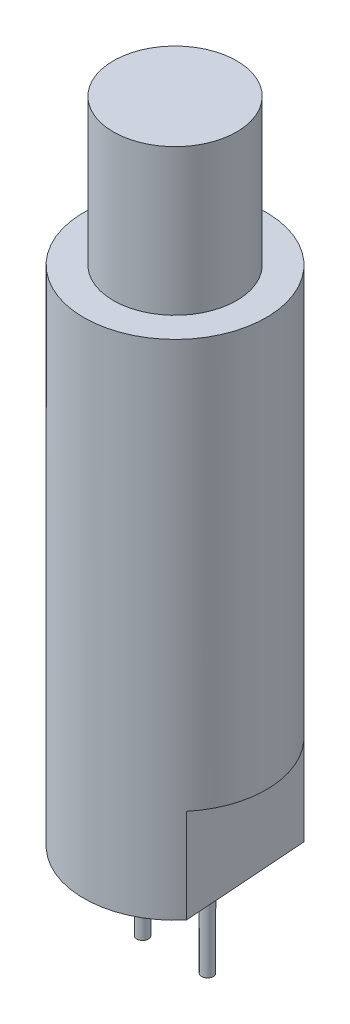
ISO-10303-21;
HEADER;
FILE_DESCRIPTION(('STEP AP214'),'2;1');
FILE_NAME('part.step','',(''),(''),'','','');
FILE_SCHEMA(('AUTOMOTIVE_DESIGN { 1 0 10303 214 1 1 1 1 }'));
ENDSEC;
DATA;
#1=APPLICATION_CONTEXT('core data for automotive mechanical design processes');
#2=APPLICATION_PROTOCOL_DEFINITION('international standard','automotive_design',2000,#1);
#3=PRODUCT_CONTEXT('',#1,'mechanical');
#4=PRODUCT('Part','Part','',(#3));
#5=PRODUCT_RELATED_PRODUCT_CATEGORY('part','',(#4));
#6=PRODUCT_DEFINITION_FORMATION('','',#4);
#7=PRODUCT_DEFINITION_CONTEXT('part definition',#1,'design');
#8=PRODUCT_DEFINITION('design','',#6,#7);
#9=PRODUCT_DEFINITION_SHAPE('','',#8);
#10=(LENGTH_UNIT() NAMED_UNIT(*) SI_UNIT(.MILLI.,.METRE.));
#11=(NAMED_UNIT(*) PLANE_ANGLE_UNIT() SI_UNIT($,.RADIAN.));
#12=(NAMED_UNIT(*) SI_UNIT($,.STERADIAN.) SOLID_ANGLE_UNIT());
#13=UNCERTAINTY_MEASURE_WITH_UNIT(LENGTH_MEASURE(1.E-05),#10,'distance_accuracy_value','');
#14=(GEOMETRIC_REPRESENTATION_CONTEXT(3) GLOBAL_UNCERTAINTY_ASSIGNED_CONTEXT((#13)) GLOBAL_UNIT_ASSIGNED_CONTEXT((#10,
#11,#12)) REPRESENTATION_CONTEXT('',''));
#15=CARTESIAN_POINT('',(0.,0.,0.));
#16=DIRECTION('',(0.,0.,1.));
#17=DIRECTION('',(1.,0.,0.));
#18=AXIS2_PLACEMENT_3D('',#15,#16,#17);
#19=CARTESIAN_POINT('',(0.,19.685,0.));
#20=DIRECTION('',(0.,-1.,0.));
#21=DIRECTION('',(0.,0.,-1.));
#22=AXIS2_PLACEMENT_3D('',#19,#20,#21);
#23=CYLINDRICAL_SURFACE('',#22,3.5687);
#24=CARTESIAN_POINT('',(0.,19.685,0.));
#25=DIRECTION('',(0.,1.,0.));
#26=DIRECTION('',(0.,0.,1.));
#27=AXIS2_PLACEMENT_3D('',#24,#25,#26);
#28=CIRCLE('',#27,3.5687);
#29=CARTESIAN_POINT('',(0.,19.685,3.5687));
#30=VERTEX_POINT('',#29);
#31=EDGE_CURVE('E78',#30,#30,#28,.T.);
#32=ORIENTED_EDGE('',*,*,#31,.F.);
#33=EDGE_LOOP('',(#32));
#34=FACE_BOUND('',#33,.T.);
#35=CARTESIAN_POINT('',(0.,3.683,0.));
#36=DIRECTION('',(0.,-1.,0.));
#37=DIRECTION('',(0.,0.,-1.));
#38=AXIS2_PLACEMENT_3D('',#35,#36,#37);
#39=CIRCLE('',#38,3.5687);
#40=CARTESIAN_POINT('',(2.39057378200329,3.683,-2.64967482586042));
#41=VERTEX_POINT('',#40);
#42=CARTESIAN_POINT('',(2.7387679671081,3.683,2.28796191234525));
#43=VERTEX_POINT('',#42);
#44=EDGE_CURVE('E11',#41,#43,#39,.T.);
#45=ORIENTED_EDGE('',*,*,#44,.F.);
#46=DIRECTION('',(0.,-1.,0.));
#47=VECTOR('',#46,1.);
#48=CARTESIAN_POINT('',(2.39057378200329,3.683,-2.64967482586042));
#49=LINE('',#48,#47);
#50=CARTESIAN_POINT('',(2.39057378200329,0.,-2.64967482586042));
#51=VERTEX_POINT('',#50);
#52=EDGE_CURVE('E58',#41,#51,#49,.T.);
#53=ORIENTED_EDGE('',*,*,#52,.T.);
#54=CARTESIAN_POINT('',(0.,0.,0.));
#55=DIRECTION('',(0.,1.,0.));
#56=DIRECTION('',(0.,0.,1.));
#57=AXIS2_PLACEMENT_3D('',#54,#55,#56);
#58=CIRCLE('',#57,3.5687);
#59=CARTESIAN_POINT('',(2.7387679671081,0.,2.28796191234525));
#60=VERTEX_POINT('',#59);
#61=EDGE_CURVE('E72',#51,#60,#58,.T.);
#62=ORIENTED_EDGE('',*,*,#61,.T.);
#63=DIRECTION('',(0.,-1.,0.));
#64=VECTOR('',#63,1.);
#65=CARTESIAN_POINT('',(2.7387679671081,3.683,2.28796191234525));
#66=LINE('',#65,#64);
#67=EDGE_CURVE('E52',#43,#60,#66,.T.);
#68=ORIENTED_EDGE('',*,*,#67,.F.);
#69=EDGE_LOOP('',(#45,#53,#62,#68));
#70=FACE_BOUND('',#69,.T.);
#71=ADVANCED_FACE('F37',(#34,#70),#23,.T.);
#72=CARTESIAN_POINT('',(0.,19.685,0.));
#73=DIRECTION('',(0.,1.,0.));
#74=DIRECTION('',(0.,0.,1.));
#75=AXIS2_PLACEMENT_3D('',#72,#73,#74);
#76=PLANE('',#75);
#77=CARTESIAN_POINT('',(0.,19.685,0.));
#78=DIRECTION('',(0.,1.,0.));
#79=DIRECTION('',(0.,0.,1.));
#80=AXIS2_PLACEMENT_3D('',#77,#78,#79);
#81=CIRCLE('',#80,2.413);
#82=CARTESIAN_POINT('',(0.,19.685,2.413));
#83=VERTEX_POINT('',#82);
#84=EDGE_CURVE('E85',#83,#83,#81,.T.);
#85=ORIENTED_EDGE('',*,*,#84,.F.);
#86=EDGE_LOOP('',(#85));
#87=FACE_BOUND('',#86,.T.);
#88=ORIENTED_EDGE('',*,*,#31,.T.);
#89=EDGE_LOOP('',(#88));
#90=FACE_BOUND('',#89,.T.);
#91=ADVANCED_FACE('F105',(#87,#90),#76,.T.);
#92=CARTESIAN_POINT('',(0.,0.,0.));
#93=DIRECTION('',(0.,1.,0.));
#94=DIRECTION('',(0.,0.,1.));
#95=AXIS2_PLACEMENT_3D('',#92,#93,#94);
#96=PLANE('',#95);
#97=CARTESIAN_POINT('',(-1.27,0.,0.));
#98=DIRECTION('',(0.,1.,0.));
#99=DIRECTION('',(0.,0.,1.));
#100=AXIS2_PLACEMENT_3D('',#97,#98,#99);
#101=CIRCLE('',#100,0.2286);
#102=CARTESIAN_POINT('',(-1.27,0.,0.2286));
#103=VERTEX_POINT('',#102);
#104=EDGE_CURVE('E45',#103,#103,#101,.F.);
#105=ORIENTED_EDGE('',*,*,#104,.F.);
#106=EDGE_LOOP('',(#105));
#107=FACE_BOUND('',#106,.T.);
#108=CARTESIAN_POINT('',(1.27,0.,0.));
#109=DIRECTION('',(0.,1.,0.));
#110=DIRECTION('',(0.,0.,1.));
#111=AXIS2_PLACEMENT_3D('',#108,#109,#110);
#112=CIRCLE('',#111,0.2286);
#113=CARTESIAN_POINT('',(1.27,0.,0.2286));
#114=VERTEX_POINT('',#113);
#115=EDGE_CURVE('E93',#114,#114,#112,.F.);
#116=ORIENTED_EDGE('',*,*,#115,.F.);
#117=EDGE_LOOP('',(#116));
#118=FACE_BOUND('',#117,.T.);
#119=ORIENTED_EDGE('',*,*,#61,.F.);
#120=DIRECTION('',(-0.0703437011731937,0.,-0.997522813626464));
#121=VECTOR('',#120,1.);
#122=CARTESIAN_POINT('',(2.7387679671081,0.,2.28796191234525));
#123=LINE('',#122,#121);
#124=EDGE_CURVE('E62',#60,#51,#123,.T.);
#125=ORIENTED_EDGE('',*,*,#124,.F.);
#126=EDGE_LOOP('',(#119,#125));
#127=FACE_BOUND('',#126,.T.);
#128=ADVANCED_FACE('F76',(#107,#118,#127),#96,.F.);
#129=CARTESIAN_POINT('',(0.,25.4,0.));
#130=DIRECTION('',(0.,-1.,0.));
#131=DIRECTION('',(0.,0.,-1.));
#132=AXIS2_PLACEMENT_3D('',#129,#130,#131);
#133=CYLINDRICAL_SURFACE('',#132,2.413);
#134=CARTESIAN_POINT('',(0.,25.4,0.));
#135=DIRECTION('',(0.,1.,0.));
#136=DIRECTION('',(0.,0.,1.));
#137=AXIS2_PLACEMENT_3D('',#134,#135,#136);
#138=CIRCLE('',#137,2.413);
#139=CARTESIAN_POINT('',(0.,25.4,2.413));
#140=VERTEX_POINT('',#139);
#141=EDGE_CURVE('E79',#140,#140,#138,.T.);
#142=ORIENTED_EDGE('',*,*,#141,.F.);
#143=EDGE_LOOP('',(#142));
#144=FACE_BOUND('',#143,.T.);
#145=ORIENTED_EDGE('',*,*,#84,.T.);
#146=EDGE_LOOP('',(#145));
#147=FACE_BOUND('',#146,.T.);
#148=ADVANCED_FACE('F104',(#144,#147),#133,.T.);
#149=CARTESIAN_POINT('',(0.,25.4,0.));
#150=DIRECTION('',(0.,1.,0.));
#151=DIRECTION('',(0.,0.,1.));
#152=AXIS2_PLACEMENT_3D('',#149,#150,#151);
#153=PLANE('',#152);
#154=ORIENTED_EDGE('',*,*,#141,.T.);
#155=EDGE_LOOP('',(#154));
#156=FACE_BOUND('',#155,.T.);
#157=ADVANCED_FACE('F111',(#156),#153,.T.);
#158=CARTESIAN_POINT('',(1.27,-3.683,0.));
#159=DIRECTION('',(0.,1.,0.));
#160=DIRECTION('',(0.,0.,1.));
#161=AXIS2_PLACEMENT_3D('',#158,#159,#160);
#162=CYLINDRICAL_SURFACE('',#161,0.2286);
#163=CARTESIAN_POINT('',(1.27,-3.683,0.));
#164=DIRECTION('',(0.,-1.,0.));
#165=DIRECTION('',(0.,0.,-1.));
#166=AXIS2_PLACEMENT_3D('',#163,#164,#165);
#167=CIRCLE('',#166,0.2286);
#168=CARTESIAN_POINT('',(1.27,-3.683,-0.2286));
#169=VERTEX_POINT('',#168);
#170=EDGE_CURVE('E89',#169,#169,#167,.T.);
#171=ORIENTED_EDGE('',*,*,#170,.F.);
#172=EDGE_LOOP('',(#171));
#173=FACE_BOUND('',#172,.T.);
#174=ORIENTED_EDGE('',*,*,#115,.T.);
#175=EDGE_LOOP('',(#174));
#176=FACE_BOUND('',#175,.T.);
#177=ADVANCED_FACE('F108',(#173,#176),#162,.T.);
#178=CARTESIAN_POINT('',(1.27,-3.683,0.));
#179=DIRECTION('',(0.,-1.,0.));
#180=DIRECTION('',(0.,0.,-1.));
#181=AXIS2_PLACEMENT_3D('',#178,#179,#180);
#182=PLANE('',#181);
#183=ORIENTED_EDGE('',*,*,#170,.T.);
#184=EDGE_LOOP('',(#183));
#185=FACE_BOUND('',#184,.T.);
#186=ADVANCED_FACE('F110',(#185),#182,.T.);
#187=CARTESIAN_POINT('',(-1.27,-3.683,0.));
#188=DIRECTION('',(0.,1.,0.));
#189=DIRECTION('',(0.,0.,1.));
#190=AXIS2_PLACEMENT_3D('',#187,#188,#189);
#191=CYLINDRICAL_SURFACE('',#190,0.2286);
#192=CARTESIAN_POINT('',(-1.27,-3.683,0.));
#193=DIRECTION('',(0.,-1.,0.));
#194=DIRECTION('',(0.,0.,-1.));
#195=AXIS2_PLACEMENT_3D('',#192,#193,#194);
#196=CIRCLE('',#195,0.2286);
#197=CARTESIAN_POINT('',(-1.27,-3.683,-0.2286));
#198=VERTEX_POINT('',#197);
#199=EDGE_CURVE('E74',#198,#198,#196,.T.);
#200=ORIENTED_EDGE('',*,*,#199,.F.);
#201=EDGE_LOOP('',(#200));
#202=FACE_BOUND('',#201,.T.);
#203=ORIENTED_EDGE('',*,*,#104,.T.);
#204=EDGE_LOOP('',(#203));
#205=FACE_BOUND('',#204,.T.);
#206=ADVANCED_FACE('F100',(#202,#205),#191,.T.);
#207=CARTESIAN_POINT('',(-1.27,-3.683,0.));
#208=DIRECTION('',(0.,-1.,0.));
#209=DIRECTION('',(0.,0.,-1.));
#210=AXIS2_PLACEMENT_3D('',#207,#208,#209);
#211=PLANE('',#210);
#212=ORIENTED_EDGE('',*,*,#199,.T.);
#213=EDGE_LOOP('',(#212));
#214=FACE_BOUND('',#213,.T.);
#215=ADVANCED_FACE('F155',(#214),#211,.T.);
#216=CARTESIAN_POINT('',(0.,3.683,0.));
#217=DIRECTION('',(0.,-1.,0.));
#218=DIRECTION('',(0.,0.,-1.));
#219=AXIS2_PLACEMENT_3D('',#216,#217,#218);
#220=PLANE('',#219);
#221=ORIENTED_EDGE('',*,*,#44,.T.);
#222=DIRECTION('',(-0.0703437011731937,0.,-0.997522813626464));
#223=VECTOR('',#222,1.);
#224=CARTESIAN_POINT('',(2.7387679671081,3.683,2.28796191234525));
#225=LINE('',#224,#223);
#226=EDGE_CURVE('E68',#43,#41,#225,.T.);
#227=ORIENTED_EDGE('',*,*,#226,.T.);
#228=EDGE_LOOP('',(#221,#227));
#229=FACE_BOUND('',#228,.T.);
#230=ADVANCED_FACE('F153',(#229),#220,.T.);
#231=CARTESIAN_POINT('',(2.7387679671081,3.683,2.28796191234525));
#232=DIRECTION('',(-0.997522813626464,0.,0.0703437011731937));
#233=DIRECTION('',(0.0703437011731937,0.,0.997522813626464));
#234=AXIS2_PLACEMENT_3D('',#231,#232,#233);
#235=PLANE('',#234);
#236=ORIENTED_EDGE('',*,*,#124,.T.);
#237=ORIENTED_EDGE('',*,*,#52,.F.);
#238=ORIENTED_EDGE('',*,*,#226,.F.);
#239=ORIENTED_EDGE('',*,*,#67,.T.);
#240=EDGE_LOOP('',(#236,#237,#238,#239));
#241=FACE_BOUND('',#240,.T.);
#242=ADVANCED_FACE('F63',(#241),#235,.F.);
#243=CLOSED_SHELL('',(#71,#91,#128,#148,#157,#177,#186,#206,#215,#230,#242));
#244=MANIFOLD_SOLID_BREP('B2',#243);
#245=ADVANCED_BREP_SHAPE_REPRESENTATION('',(#18,#244),#14);
#246=SHAPE_DEFINITION_REPRESENTATION(#9,#245);
ENDSEC;
END-ISO-10303-21;
